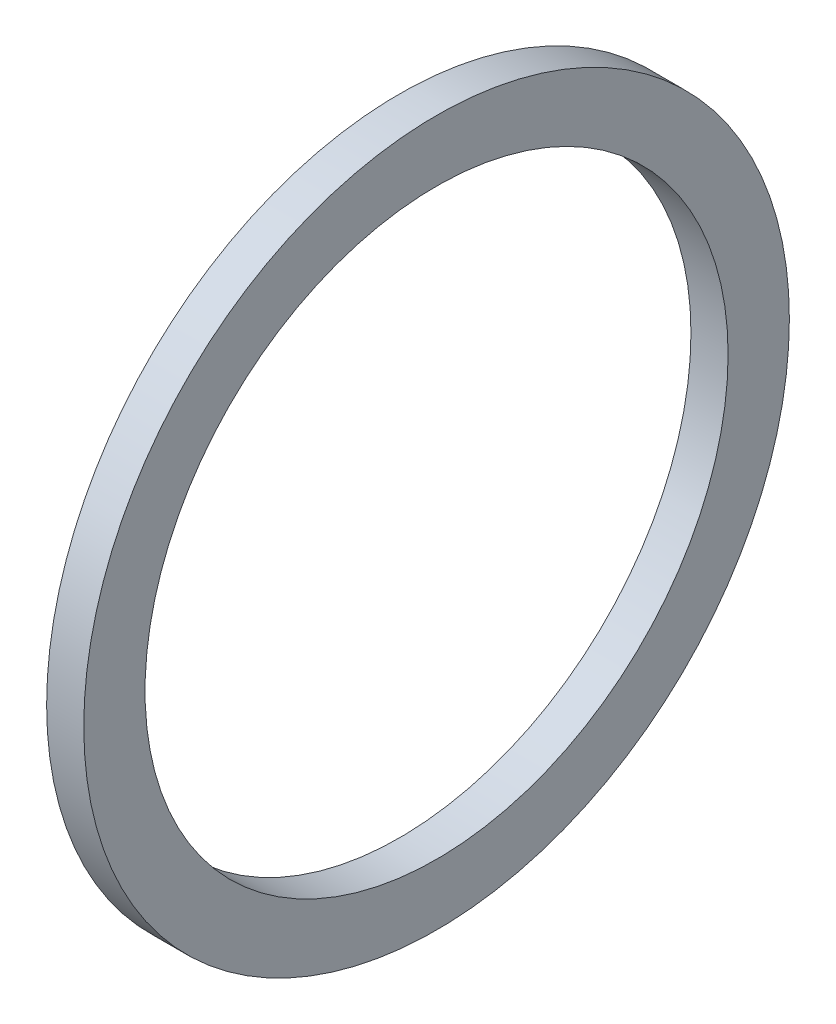
ISO-10303-21;
HEADER;
FILE_DESCRIPTION(('STEP AP214'),'2;1');
FILE_NAME('part.step','',(''),(''),'','','');
FILE_SCHEMA(('AUTOMOTIVE_DESIGN { 1 0 10303 214 1 1 1 1 }'));
ENDSEC;
DATA;
#1=APPLICATION_CONTEXT('core data for automotive mechanical design processes');
#2=APPLICATION_PROTOCOL_DEFINITION('international standard','automotive_design',2000,#1);
#3=PRODUCT_CONTEXT('',#1,'mechanical');
#4=PRODUCT('Part','Part','',(#3));
#5=PRODUCT_RELATED_PRODUCT_CATEGORY('part','',(#4));
#6=PRODUCT_DEFINITION_FORMATION('','',#4);
#7=PRODUCT_DEFINITION_CONTEXT('part definition',#1,'design');
#8=PRODUCT_DEFINITION('design','',#6,#7);
#9=PRODUCT_DEFINITION_SHAPE('','',#8);
#10=(LENGTH_UNIT() NAMED_UNIT(*) SI_UNIT(.MILLI.,.METRE.));
#11=(NAMED_UNIT(*) PLANE_ANGLE_UNIT() SI_UNIT($,.RADIAN.));
#12=(NAMED_UNIT(*) SI_UNIT($,.STERADIAN.) SOLID_ANGLE_UNIT());
#13=UNCERTAINTY_MEASURE_WITH_UNIT(LENGTH_MEASURE(1.E-05),#10,'distance_accuracy_value','');
#14=(GEOMETRIC_REPRESENTATION_CONTEXT(3) GLOBAL_UNCERTAINTY_ASSIGNED_CONTEXT((#13)) GLOBAL_UNIT_ASSIGNED_CONTEXT((#10,
#11,#12)) REPRESENTATION_CONTEXT('',''));
#15=CARTESIAN_POINT('',(0.,0.,0.));
#16=DIRECTION('',(0.,0.,1.));
#17=DIRECTION('',(1.,0.,0.));
#18=AXIS2_PLACEMENT_3D('',#15,#16,#17);
#19=CARTESIAN_POINT('',(1.,0.,0.));
#20=DIRECTION('',(1.,0.,0.));
#21=DIRECTION('',(0.,0.,-1.));
#22=AXIS2_PLACEMENT_3D('',#19,#20,#21);
#23=PLANE('',#22);
#24=CARTESIAN_POINT('',(1.,0.,0.));
#25=DIRECTION('',(1.,0.,0.));
#26=DIRECTION('',(0.,0.,-1.));
#27=AXIS2_PLACEMENT_3D('',#24,#25,#26);
#28=CIRCLE('',#27,9.5);
#29=CARTESIAN_POINT('',(1.,0.,-9.5));
#30=VERTEX_POINT('',#29);
#31=EDGE_CURVE('E10',#30,#30,#28,.T.);
#32=ORIENTED_EDGE('',*,*,#31,.T.);
#33=EDGE_LOOP('',(#32));
#34=FACE_BOUND('',#33,.T.);
#35=CARTESIAN_POINT('',(1.,0.,0.));
#36=DIRECTION('',(1.,0.,0.));
#37=DIRECTION('',(0.,0.,-1.));
#38=AXIS2_PLACEMENT_3D('',#35,#36,#37);
#39=CIRCLE('',#38,7.85);
#40=CARTESIAN_POINT('',(1.,0.,-7.85));
#41=VERTEX_POINT('',#40);
#42=EDGE_CURVE('E42',#41,#41,#39,.T.);
#43=ORIENTED_EDGE('',*,*,#42,.F.);
#44=EDGE_LOOP('',(#43));
#45=FACE_BOUND('',#44,.T.);
#46=ADVANCED_FACE('F31',(#34,#45),#23,.T.);
#47=CARTESIAN_POINT('',(0.,0.,0.));
#48=DIRECTION('',(1.,0.,0.));
#49=DIRECTION('',(0.,0.,-1.));
#50=AXIS2_PLACEMENT_3D('',#47,#48,#49);
#51=PLANE('',#50);
#52=CARTESIAN_POINT('',(0.,0.,0.));
#53=DIRECTION('',(1.,0.,0.));
#54=DIRECTION('',(0.,0.,-1.));
#55=AXIS2_PLACEMENT_3D('',#52,#53,#54);
#56=CIRCLE('',#55,9.5);
#57=CARTESIAN_POINT('',(0.,0.,-9.5));
#58=VERTEX_POINT('',#57);
#59=EDGE_CURVE('E35',#58,#58,#56,.T.);
#60=ORIENTED_EDGE('',*,*,#59,.F.);
#61=EDGE_LOOP('',(#60));
#62=FACE_BOUND('',#61,.T.);
#63=CARTESIAN_POINT('',(0.,0.,0.));
#64=DIRECTION('',(1.,0.,0.));
#65=DIRECTION('',(0.,0.,-1.));
#66=AXIS2_PLACEMENT_3D('',#63,#64,#65);
#67=CIRCLE('',#66,7.85);
#68=CARTESIAN_POINT('',(0.,0.,-7.85));
#69=VERTEX_POINT('',#68);
#70=EDGE_CURVE('E44',#69,#69,#67,.T.);
#71=ORIENTED_EDGE('',*,*,#70,.T.);
#72=EDGE_LOOP('',(#71));
#73=FACE_BOUND('',#72,.T.);
#74=ADVANCED_FACE('F54',(#62,#73),#51,.F.);
#75=CARTESIAN_POINT('',(1.,0.,0.));
#76=DIRECTION('',(-1.,0.,0.));
#77=DIRECTION('',(0.,0.,1.));
#78=AXIS2_PLACEMENT_3D('',#75,#76,#77);
#79=CYLINDRICAL_SURFACE('',#78,9.5);
#80=ORIENTED_EDGE('',*,*,#31,.F.);
#81=EDGE_LOOP('',(#80));
#82=FACE_BOUND('',#81,.T.);
#83=ORIENTED_EDGE('',*,*,#59,.T.);
#84=EDGE_LOOP('',(#83));
#85=FACE_BOUND('',#84,.T.);
#86=ADVANCED_FACE('F33',(#82,#85),#79,.T.);
#87=CARTESIAN_POINT('',(1.,0.,0.));
#88=DIRECTION('',(-1.,0.,0.));
#89=DIRECTION('',(0.,0.,1.));
#90=AXIS2_PLACEMENT_3D('',#87,#88,#89);
#91=CYLINDRICAL_SURFACE('',#90,7.85);
#92=ORIENTED_EDGE('',*,*,#42,.T.);
#93=EDGE_LOOP('',(#92));
#94=FACE_BOUND('',#93,.T.);
#95=ORIENTED_EDGE('',*,*,#70,.F.);
#96=EDGE_LOOP('',(#95));
#97=FACE_BOUND('',#96,.T.);
#98=ADVANCED_FACE('F50',(#94,#97),#91,.F.);
#99=CLOSED_SHELL('',(#46,#74,#86,#98));
#100=MANIFOLD_SOLID_BREP('B2',#99);
#101=ADVANCED_BREP_SHAPE_REPRESENTATION('',(#18,#100),#14);
#102=SHAPE_DEFINITION_REPRESENTATION(#9,#101);
ENDSEC;
END-ISO-10303-21;
